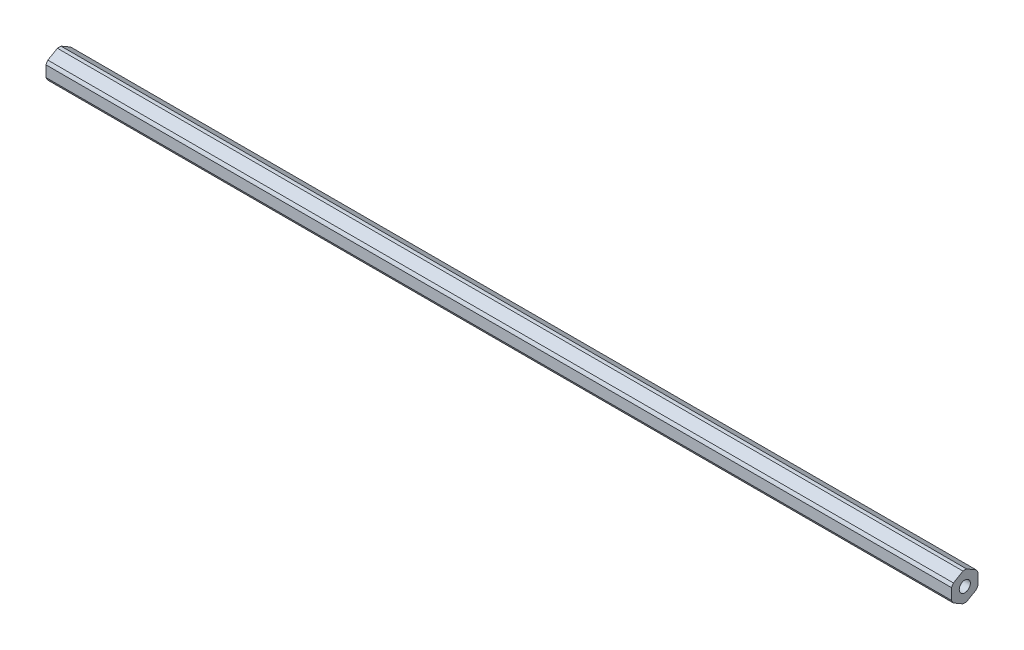
ISO-10303-21;
HEADER;
FILE_DESCRIPTION(('STEP AP214'),'2;1');
FILE_NAME('part.step','',(''),(''),'','','');
FILE_SCHEMA(('AUTOMOTIVE_DESIGN { 1 0 10303 214 1 1 1 1 }'));
ENDSEC;
DATA;
#1=APPLICATION_CONTEXT('core data for automotive mechanical design processes');
#2=APPLICATION_PROTOCOL_DEFINITION('international standard','automotive_design',2000,#1);
#3=PRODUCT_CONTEXT('',#1,'mechanical');
#4=PRODUCT('Part','Part','',(#3));
#5=PRODUCT_RELATED_PRODUCT_CATEGORY('part','',(#4));
#6=PRODUCT_DEFINITION_FORMATION('','',#4);
#7=PRODUCT_DEFINITION_CONTEXT('part definition',#1,'design');
#8=PRODUCT_DEFINITION('design','',#6,#7);
#9=PRODUCT_DEFINITION_SHAPE('','',#8);
#10=(LENGTH_UNIT() NAMED_UNIT(*) SI_UNIT(.MILLI.,.METRE.));
#11=(NAMED_UNIT(*) PLANE_ANGLE_UNIT() SI_UNIT($,.RADIAN.));
#12=(NAMED_UNIT(*) SI_UNIT($,.STERADIAN.) SOLID_ANGLE_UNIT());
#13=UNCERTAINTY_MEASURE_WITH_UNIT(LENGTH_MEASURE(1.E-05),#10,'distance_accuracy_value','');
#14=(GEOMETRIC_REPRESENTATION_CONTEXT(3) GLOBAL_UNCERTAINTY_ASSIGNED_CONTEXT((#13)) GLOBAL_UNIT_ASSIGNED_CONTEXT((#10,
#11,#12)) REPRESENTATION_CONTEXT('',''));
#15=CARTESIAN_POINT('',(0.,0.,0.));
#16=DIRECTION('',(0.,0.,1.));
#17=DIRECTION('',(1.,0.,0.));
#18=AXIS2_PLACEMENT_3D('',#15,#16,#17);
#19=CARTESIAN_POINT('',(-190.627,0.,-5.64652491430451E-13));
#20=DIRECTION('',(1.,0.,0.));
#21=DIRECTION('',(0.,0.,-1.));
#22=AXIS2_PLACEMENT_3D('',#19,#20,#21);
#23=CYLINDRICAL_SURFACE('',#22,6.88000000000029);
#24=CARTESIAN_POINT('',(244.475,0.,-5.64652491430451E-13));
#25=DIRECTION('',(1.,0.,0.));
#26=DIRECTION('',(0.,0.,-1.));
#27=AXIS2_PLACEMENT_3D('',#24,#25,#26);
#28=CIRCLE('',#27,6.88000000000029);
#29=CARTESIAN_POINT('',(244.475,2.64799924471248,-6.35000000000105));
#30=VERTEX_POINT('',#29);
#31=CARTESIAN_POINT('',(244.475,4.17526169167448,-5.46823461512449));
#32=VERTEX_POINT('',#31);
#33=EDGE_CURVE('E154',#30,#32,#28,.T.);
#34=ORIENTED_EDGE('',*,*,#33,.F.);
#35=DIRECTION('',(1.,0.,0.));
#36=VECTOR('',#35,1.);
#37=CARTESIAN_POINT('',(-190.627,2.64799924471248,-6.35000000000105));
#38=LINE('',#37,#36);
#39=CARTESIAN_POINT('',(-190.627,2.64799924471248,-6.35000000000105));
#40=VERTEX_POINT('',#39);
#41=EDGE_CURVE('E11',#40,#30,#38,.T.);
#42=ORIENTED_EDGE('',*,*,#41,.F.);
#43=CARTESIAN_POINT('',(-190.627,0.,-5.64652491430451E-13));
#44=DIRECTION('',(1.,0.,0.));
#45=DIRECTION('',(0.,0.,-1.));
#46=AXIS2_PLACEMENT_3D('',#43,#44,#45);
#47=CIRCLE('',#46,6.88000000000029);
#48=CARTESIAN_POINT('',(-190.627,4.17526169167448,-5.46823461512449));
#49=VERTEX_POINT('',#48);
#50=EDGE_CURVE('E187',#40,#49,#47,.T.);
#51=ORIENTED_EDGE('',*,*,#50,.T.);
#52=DIRECTION('',(1.,0.,0.));
#53=VECTOR('',#52,1.);
#54=CARTESIAN_POINT('',(-190.627,4.17526169167448,-5.46823461512449));
#55=LINE('',#54,#53);
#56=EDGE_CURVE('E36',#49,#32,#55,.T.);
#57=ORIENTED_EDGE('',*,*,#56,.T.);
#58=EDGE_LOOP('',(#34,#42,#51,#57));
#59=FACE_BOUND('',#58,.T.);
#60=ADVANCED_FACE('F33',(#59),#23,.T.);
#61=CARTESIAN_POINT('',(-190.627,-2.64799924471248,-6.35000000000105));
#62=DIRECTION('',(0.,0.,-1.));
#63=DIRECTION('',(-1.,0.,0.));
#64=AXIS2_PLACEMENT_3D('',#61,#62,#63);
#65=PLANE('',#64);
#66=DIRECTION('',(0.,1.,0.));
#67=VECTOR('',#66,1.);
#68=CARTESIAN_POINT('',(244.475,-2.64799924471248,-6.35000000000105));
#69=LINE('',#68,#67);
#70=CARTESIAN_POINT('',(244.475,-2.64799924471248,-6.35000000000105));
#71=VERTEX_POINT('',#70);
#72=EDGE_CURVE('E185',#71,#30,#69,.T.);
#73=ORIENTED_EDGE('',*,*,#72,.F.);
#74=DIRECTION('',(1.,0.,0.));
#75=VECTOR('',#74,1.);
#76=CARTESIAN_POINT('',(-190.627,-2.64799924471248,-6.35000000000105));
#77=LINE('',#76,#75);
#78=CARTESIAN_POINT('',(-190.627,-2.64799924471248,-6.35000000000105));
#79=VERTEX_POINT('',#78);
#80=EDGE_CURVE('E42',#79,#71,#77,.T.);
#81=ORIENTED_EDGE('',*,*,#80,.F.);
#82=DIRECTION('',(0.,1.,0.));
#83=VECTOR('',#82,1.);
#84=CARTESIAN_POINT('',(-190.627,-2.64799924471248,-6.35000000000105));
#85=LINE('',#84,#83);
#86=EDGE_CURVE('E144',#79,#40,#85,.T.);
#87=ORIENTED_EDGE('',*,*,#86,.T.);
#88=ORIENTED_EDGE('',*,*,#41,.T.);
#89=EDGE_LOOP('',(#73,#81,#87,#88));
#90=FACE_BOUND('',#89,.T.);
#91=ADVANCED_FACE('F207',(#90),#65,.T.);
#92=CARTESIAN_POINT('',(-190.627,0.,-5.64652491430451E-13));
#93=DIRECTION('',(1.,0.,0.));
#94=DIRECTION('',(0.,0.,-1.));
#95=AXIS2_PLACEMENT_3D('',#92,#93,#94);
#96=CYLINDRICAL_SURFACE('',#95,6.88000000000029);
#97=CARTESIAN_POINT('',(244.475,0.,-5.64652491430451E-13));
#98=DIRECTION('',(1.,0.,0.));
#99=DIRECTION('',(0.,0.,-1.));
#100=AXIS2_PLACEMENT_3D('',#97,#98,#99);
#101=CIRCLE('',#100,6.88000000000029);
#102=CARTESIAN_POINT('',(244.475,-4.17526169167448,-5.46823461512449));
#103=VERTEX_POINT('',#102);
#104=EDGE_CURVE('E131',#103,#71,#101,.T.);
#105=ORIENTED_EDGE('',*,*,#104,.F.);
#106=DIRECTION('',(1.,0.,0.));
#107=VECTOR('',#106,1.);
#108=CARTESIAN_POINT('',(-190.627,-4.17526169167448,-5.46823461512449));
#109=LINE('',#108,#107);
#110=CARTESIAN_POINT('',(-190.627,-4.17526169167448,-5.46823461512449));
#111=VERTEX_POINT('',#110);
#112=EDGE_CURVE('E126',#111,#103,#109,.T.);
#113=ORIENTED_EDGE('',*,*,#112,.F.);
#114=CARTESIAN_POINT('',(-190.627,0.,-5.64652491430451E-13));
#115=DIRECTION('',(1.,0.,0.));
#116=DIRECTION('',(0.,0.,-1.));
#117=AXIS2_PLACEMENT_3D('',#114,#115,#116);
#118=CIRCLE('',#117,6.88000000000029);
#119=EDGE_CURVE('E129',#111,#79,#118,.T.);
#120=ORIENTED_EDGE('',*,*,#119,.T.);
#121=ORIENTED_EDGE('',*,*,#80,.T.);
#122=EDGE_LOOP('',(#105,#113,#120,#121));
#123=FACE_BOUND('',#122,.T.);
#124=ADVANCED_FACE('F128',(#123),#96,.T.);
#125=CARTESIAN_POINT('',(-190.627,-6.8232609363879,-0.881765384877347));
#126=DIRECTION('',(0.,-0.866025403784415,-0.500000000000042));
#127=DIRECTION('',(0.,0.500000000000041,-0.866025403784415));
#128=AXIS2_PLACEMENT_3D('',#125,#126,#127);
#129=PLANE('',#128);
#130=DIRECTION('',(0.,0.500000000000042,-0.866025403784415));
#131=VECTOR('',#130,1.);
#132=CARTESIAN_POINT('',(244.475,-6.8232609363879,-0.881765384877347));
#133=LINE('',#132,#131);
#134=CARTESIAN_POINT('',(244.475,-6.8232609363879,-0.881765384877347));
#135=VERTEX_POINT('',#134);
#136=EDGE_CURVE('E182',#135,#103,#133,.T.);
#137=ORIENTED_EDGE('',*,*,#136,.F.);
#138=DIRECTION('',(1.,0.,0.));
#139=VECTOR('',#138,1.);
#140=CARTESIAN_POINT('',(-190.627,-6.8232609363879,-0.881765384877347));
#141=LINE('',#140,#139);
#142=CARTESIAN_POINT('',(-190.627,-6.8232609363879,-0.881765384877347));
#143=VERTEX_POINT('',#142);
#144=EDGE_CURVE('E136',#143,#135,#141,.T.);
#145=ORIENTED_EDGE('',*,*,#144,.F.);
#146=DIRECTION('',(0.,0.500000000000042,-0.866025403784415));
#147=VECTOR('',#146,1.);
#148=CARTESIAN_POINT('',(-190.627,-6.8232609363879,-0.881765384877347));
#149=LINE('',#148,#147);
#150=EDGE_CURVE('E142',#143,#111,#149,.T.);
#151=ORIENTED_EDGE('',*,*,#150,.T.);
#152=ORIENTED_EDGE('',*,*,#112,.T.);
#153=EDGE_LOOP('',(#137,#145,#151,#152));
#154=FACE_BOUND('',#153,.T.);
#155=ADVANCED_FACE('F146',(#154),#129,.T.);
#156=CARTESIAN_POINT('',(-190.627,0.,-5.64652491430451E-13));
#157=DIRECTION('',(1.,0.,0.));
#158=DIRECTION('',(0.,0.,-1.));
#159=AXIS2_PLACEMENT_3D('',#156,#157,#158);
#160=CYLINDRICAL_SURFACE('',#159,6.88000000000029);
#161=CARTESIAN_POINT('',(244.475,0.,-5.64652491430451E-13));
#162=DIRECTION('',(1.,0.,0.));
#163=DIRECTION('',(0.,0.,-1.));
#164=AXIS2_PLACEMENT_3D('',#161,#162,#163);
#165=CIRCLE('',#164,6.88000000000029);
#166=CARTESIAN_POINT('',(244.475,-6.8232609363879,0.881765384876218));
#167=VERTEX_POINT('',#166);
#168=EDGE_CURVE('E179',#167,#135,#165,.T.);
#169=ORIENTED_EDGE('',*,*,#168,.F.);
#170=DIRECTION('',(1.,0.,0.));
#171=VECTOR('',#170,1.);
#172=CARTESIAN_POINT('',(-190.627,-6.8232609363879,0.881765384876218));
#173=LINE('',#172,#171);
#174=CARTESIAN_POINT('',(-190.627,-6.8232609363879,0.881765384876218));
#175=VERTEX_POINT('',#174);
#176=EDGE_CURVE('E191',#175,#167,#173,.T.);
#177=ORIENTED_EDGE('',*,*,#176,.F.);
#178=CARTESIAN_POINT('',(-190.627,0.,-5.64652491430451E-13));
#179=DIRECTION('',(1.,0.,0.));
#180=DIRECTION('',(0.,0.,-1.));
#181=AXIS2_PLACEMENT_3D('',#178,#179,#180);
#182=CIRCLE('',#181,6.88000000000029);
#183=EDGE_CURVE('E147',#175,#143,#182,.T.);
#184=ORIENTED_EDGE('',*,*,#183,.T.);
#185=ORIENTED_EDGE('',*,*,#144,.T.);
#186=EDGE_LOOP('',(#169,#177,#184,#185));
#187=FACE_BOUND('',#186,.T.);
#188=ADVANCED_FACE('F220',(#187),#160,.T.);
#189=CARTESIAN_POINT('',(-190.627,-4.17526169167448,5.46823461512336));
#190=DIRECTION('',(0.,-0.866025403784415,0.500000000000042));
#191=DIRECTION('',(0.,-0.500000000000041,-0.866025403784415));
#192=AXIS2_PLACEMENT_3D('',#189,#190,#191);
#193=PLANE('',#192);
#194=DIRECTION('',(0.,-0.500000000000042,-0.866025403784415));
#195=VECTOR('',#194,1.);
#196=CARTESIAN_POINT('',(244.475,-4.17526169167448,5.46823461512336));
#197=LINE('',#196,#195);
#198=CARTESIAN_POINT('',(244.475,-4.17526169167448,5.46823461512336));
#199=VERTEX_POINT('',#198);
#200=EDGE_CURVE('E176',#199,#167,#197,.T.);
#201=ORIENTED_EDGE('',*,*,#200,.F.);
#202=DIRECTION('',(1.,0.,0.));
#203=VECTOR('',#202,1.);
#204=CARTESIAN_POINT('',(-190.627,-4.17526169167448,5.46823461512336));
#205=LINE('',#204,#203);
#206=CARTESIAN_POINT('',(-190.627,-4.17526169167448,5.46823461512336));
#207=VERTEX_POINT('',#206);
#208=EDGE_CURVE('E193',#207,#199,#205,.T.);
#209=ORIENTED_EDGE('',*,*,#208,.F.);
#210=DIRECTION('',(0.,-0.500000000000042,-0.866025403784415));
#211=VECTOR('',#210,1.);
#212=CARTESIAN_POINT('',(-190.627,-4.17526169167448,5.46823461512336));
#213=LINE('',#212,#211);
#214=EDGE_CURVE('E149',#207,#175,#213,.T.);
#215=ORIENTED_EDGE('',*,*,#214,.T.);
#216=ORIENTED_EDGE('',*,*,#176,.T.);
#217=EDGE_LOOP('',(#201,#209,#215,#216));
#218=FACE_BOUND('',#217,.T.);
#219=ADVANCED_FACE('F223',(#218),#193,.T.);
#220=CARTESIAN_POINT('',(-190.627,0.,-5.64652491430451E-13));
#221=DIRECTION('',(1.,0.,0.));
#222=DIRECTION('',(0.,0.,-1.));
#223=AXIS2_PLACEMENT_3D('',#220,#221,#222);
#224=CYLINDRICAL_SURFACE('',#223,6.88000000000029);
#225=CARTESIAN_POINT('',(244.475,0.,-5.64652491430451E-13));
#226=DIRECTION('',(1.,0.,0.));
#227=DIRECTION('',(0.,0.,-1.));
#228=AXIS2_PLACEMENT_3D('',#225,#226,#227);
#229=CIRCLE('',#228,6.88000000000029);
#230=CARTESIAN_POINT('',(244.475,-2.64799924471228,6.35));
#231=VERTEX_POINT('',#230);
#232=EDGE_CURVE('E173',#231,#199,#229,.T.);
#233=ORIENTED_EDGE('',*,*,#232,.F.);
#234=DIRECTION('',(1.,0.,0.));
#235=VECTOR('',#234,1.);
#236=CARTESIAN_POINT('',(-190.627,-2.64799924471228,6.35));
#237=LINE('',#236,#235);
#238=CARTESIAN_POINT('',(-190.627,-2.64799924471228,6.35));
#239=VERTEX_POINT('',#238);
#240=EDGE_CURVE('E195',#239,#231,#237,.T.);
#241=ORIENTED_EDGE('',*,*,#240,.F.);
#242=CARTESIAN_POINT('',(-190.627,0.,-5.64652491430451E-13));
#243=DIRECTION('',(1.,0.,0.));
#244=DIRECTION('',(0.,0.,-1.));
#245=AXIS2_PLACEMENT_3D('',#242,#243,#244);
#246=CIRCLE('',#245,6.88000000000029);
#247=EDGE_CURVE('E286',#239,#207,#246,.T.);
#248=ORIENTED_EDGE('',*,*,#247,.T.);
#249=ORIENTED_EDGE('',*,*,#208,.T.);
#250=EDGE_LOOP('',(#233,#241,#248,#249));
#251=FACE_BOUND('',#250,.T.);
#252=ADVANCED_FACE('F227',(#251),#224,.T.);
#253=CARTESIAN_POINT('',(-190.627,2.64799924471228,6.35));
#254=DIRECTION('',(0.,0.,1.));
#255=DIRECTION('',(1.,0.,0.));
#256=AXIS2_PLACEMENT_3D('',#253,#254,#255);
#257=PLANE('',#256);
#258=DIRECTION('',(0.,-1.,0.));
#259=VECTOR('',#258,1.);
#260=CARTESIAN_POINT('',(244.475,2.64799924471228,6.35));
#261=LINE('',#260,#259);
#262=CARTESIAN_POINT('',(244.475,2.64799924471228,6.35));
#263=VERTEX_POINT('',#262);
#264=EDGE_CURVE('E170',#263,#231,#261,.T.);
#265=ORIENTED_EDGE('',*,*,#264,.F.);
#266=DIRECTION('',(1.,0.,0.));
#267=VECTOR('',#266,1.);
#268=CARTESIAN_POINT('',(-190.627,2.64799924471228,6.35));
#269=LINE('',#268,#267);
#270=CARTESIAN_POINT('',(-190.627,2.64799924471228,6.35));
#271=VERTEX_POINT('',#270);
#272=EDGE_CURVE('E197',#271,#263,#269,.T.);
#273=ORIENTED_EDGE('',*,*,#272,.F.);
#274=DIRECTION('',(0.,-1.,0.));
#275=VECTOR('',#274,1.);
#276=CARTESIAN_POINT('',(-190.627,2.64799924471228,6.35));
#277=LINE('',#276,#275);
#278=EDGE_CURVE('E283',#271,#239,#277,.T.);
#279=ORIENTED_EDGE('',*,*,#278,.T.);
#280=ORIENTED_EDGE('',*,*,#240,.T.);
#281=EDGE_LOOP('',(#265,#273,#279,#280));
#282=FACE_BOUND('',#281,.T.);
#283=ADVANCED_FACE('F231',(#282),#257,.T.);
#284=CARTESIAN_POINT('',(-190.627,0.,-5.64652491430451E-13));
#285=DIRECTION('',(1.,0.,0.));
#286=DIRECTION('',(0.,0.,-1.));
#287=AXIS2_PLACEMENT_3D('',#284,#285,#286);
#288=CYLINDRICAL_SURFACE('',#287,6.88000000000029);
#289=CARTESIAN_POINT('',(244.475,0.,-5.64652491430451E-13));
#290=DIRECTION('',(1.,0.,0.));
#291=DIRECTION('',(0.,0.,-1.));
#292=AXIS2_PLACEMENT_3D('',#289,#290,#291);
#293=CIRCLE('',#292,6.88000000000029);
#294=CARTESIAN_POINT('',(244.475,4.17526169167448,5.46823461512336));
#295=VERTEX_POINT('',#294);
#296=EDGE_CURVE('E167',#295,#263,#293,.T.);
#297=ORIENTED_EDGE('',*,*,#296,.F.);
#298=DIRECTION('',(1.,0.,0.));
#299=VECTOR('',#298,1.);
#300=CARTESIAN_POINT('',(-190.627,4.17526169167448,5.46823461512336));
#301=LINE('',#300,#299);
#302=CARTESIAN_POINT('',(-190.627,4.17526169167448,5.46823461512336));
#303=VERTEX_POINT('',#302);
#304=EDGE_CURVE('E199',#303,#295,#301,.T.);
#305=ORIENTED_EDGE('',*,*,#304,.F.);
#306=CARTESIAN_POINT('',(-190.627,0.,-5.64652491430451E-13));
#307=DIRECTION('',(1.,0.,0.));
#308=DIRECTION('',(0.,0.,-1.));
#309=AXIS2_PLACEMENT_3D('',#306,#307,#308);
#310=CIRCLE('',#309,6.88000000000029);
#311=EDGE_CURVE('E280',#303,#271,#310,.T.);
#312=ORIENTED_EDGE('',*,*,#311,.T.);
#313=ORIENTED_EDGE('',*,*,#272,.T.);
#314=EDGE_LOOP('',(#297,#305,#312,#313));
#315=FACE_BOUND('',#314,.T.);
#316=ADVANCED_FACE('F235',(#315),#288,.T.);
#317=CARTESIAN_POINT('',(-190.627,6.8232609363879,0.881765384876217));
#318=DIRECTION('',(0.,0.866025403784415,0.500000000000042));
#319=DIRECTION('',(0.,-0.500000000000041,0.866025403784415));
#320=AXIS2_PLACEMENT_3D('',#317,#318,#319);
#321=PLANE('',#320);
#322=DIRECTION('',(0.,-0.500000000000042,0.866025403784415));
#323=VECTOR('',#322,1.);
#324=CARTESIAN_POINT('',(244.475,6.8232609363879,0.881765384876217));
#325=LINE('',#324,#323);
#326=CARTESIAN_POINT('',(244.475,6.8232609363879,0.881765384876217));
#327=VERTEX_POINT('',#326);
#328=EDGE_CURVE('E164',#327,#295,#325,.T.);
#329=ORIENTED_EDGE('',*,*,#328,.F.);
#330=DIRECTION('',(1.,0.,0.));
#331=VECTOR('',#330,1.);
#332=CARTESIAN_POINT('',(-190.627,6.8232609363879,0.881765384876217));
#333=LINE('',#332,#331);
#334=CARTESIAN_POINT('',(-190.627,6.8232609363879,0.881765384876217));
#335=VERTEX_POINT('',#334);
#336=EDGE_CURVE('E201',#335,#327,#333,.T.);
#337=ORIENTED_EDGE('',*,*,#336,.F.);
#338=DIRECTION('',(0.,-0.500000000000042,0.866025403784415));
#339=VECTOR('',#338,1.);
#340=CARTESIAN_POINT('',(-190.627,6.8232609363879,0.881765384876217));
#341=LINE('',#340,#339);
#342=EDGE_CURVE('E277',#335,#303,#341,.T.);
#343=ORIENTED_EDGE('',*,*,#342,.T.);
#344=ORIENTED_EDGE('',*,*,#304,.T.);
#345=EDGE_LOOP('',(#329,#337,#343,#344));
#346=FACE_BOUND('',#345,.T.);
#347=ADVANCED_FACE('F239',(#346),#321,.T.);
#348=CARTESIAN_POINT('',(-190.627,0.,-5.64652491430451E-13));
#349=DIRECTION('',(1.,0.,0.));
#350=DIRECTION('',(0.,0.,-1.));
#351=AXIS2_PLACEMENT_3D('',#348,#349,#350);
#352=CYLINDRICAL_SURFACE('',#351,6.88000000000029);
#353=CARTESIAN_POINT('',(244.475,0.,-5.64652491430451E-13));
#354=DIRECTION('',(1.,0.,0.));
#355=DIRECTION('',(0.,0.,-1.));
#356=AXIS2_PLACEMENT_3D('',#353,#354,#355);
#357=CIRCLE('',#356,6.88000000000029);
#358=CARTESIAN_POINT('',(244.475,6.8232609363879,-0.881765384877347));
#359=VERTEX_POINT('',#358);
#360=EDGE_CURVE('E161',#359,#327,#357,.T.);
#361=ORIENTED_EDGE('',*,*,#360,.F.);
#362=DIRECTION('',(1.,0.,0.));
#363=VECTOR('',#362,1.);
#364=CARTESIAN_POINT('',(-190.627,6.8232609363879,-0.881765384877347));
#365=LINE('',#364,#363);
#366=CARTESIAN_POINT('',(-190.627,6.8232609363879,-0.881765384877347));
#367=VERTEX_POINT('',#366);
#368=EDGE_CURVE('E202',#367,#359,#365,.T.);
#369=ORIENTED_EDGE('',*,*,#368,.F.);
#370=CARTESIAN_POINT('',(-190.627,0.,-5.64652491430451E-13));
#371=DIRECTION('',(1.,0.,0.));
#372=DIRECTION('',(0.,0.,-1.));
#373=AXIS2_PLACEMENT_3D('',#370,#371,#372);
#374=CIRCLE('',#373,6.88000000000029);
#375=EDGE_CURVE('E274',#367,#335,#374,.T.);
#376=ORIENTED_EDGE('',*,*,#375,.T.);
#377=ORIENTED_EDGE('',*,*,#336,.T.);
#378=EDGE_LOOP('',(#361,#369,#376,#377));
#379=FACE_BOUND('',#378,.T.);
#380=ADVANCED_FACE('F243',(#379),#352,.T.);
#381=CARTESIAN_POINT('',(-190.627,4.17526169167448,-5.46823461512449));
#382=DIRECTION('',(0.,0.866025403784415,-0.500000000000042));
#383=DIRECTION('',(0.,0.500000000000041,0.866025403784415));
#384=AXIS2_PLACEMENT_3D('',#381,#382,#383);
#385=PLANE('',#384);
#386=DIRECTION('',(0.,0.500000000000042,0.866025403784415));
#387=VECTOR('',#386,1.);
#388=CARTESIAN_POINT('',(244.475,4.17526169167448,-5.46823461512449));
#389=LINE('',#388,#387);
#390=EDGE_CURVE('E157',#32,#359,#389,.T.);
#391=ORIENTED_EDGE('',*,*,#390,.F.);
#392=ORIENTED_EDGE('',*,*,#56,.F.);
#393=DIRECTION('',(0.,0.500000000000042,0.866025403784415));
#394=VECTOR('',#393,1.);
#395=CARTESIAN_POINT('',(-190.627,4.17526169167448,-5.46823461512449));
#396=LINE('',#395,#394);
#397=EDGE_CURVE('E272',#49,#367,#396,.T.);
#398=ORIENTED_EDGE('',*,*,#397,.T.);
#399=ORIENTED_EDGE('',*,*,#368,.T.);
#400=EDGE_LOOP('',(#391,#392,#398,#399));
#401=FACE_BOUND('',#400,.T.);
#402=ADVANCED_FACE('F204',(#401),#385,.T.);
#403=CARTESIAN_POINT('',(-190.627,0.,-5.64652491430451E-13));
#404=DIRECTION('',(1.,0.,0.));
#405=DIRECTION('',(0.,0.,-1.));
#406=AXIS2_PLACEMENT_3D('',#403,#404,#405);
#407=PLANE('',#406);
#408=CARTESIAN_POINT('',(-190.627,0.,-5.64652491430451E-13));
#409=DIRECTION('',(1.,0.,0.));
#410=DIRECTION('',(0.,0.,1.));
#411=AXIS2_PLACEMENT_3D('',#408,#409,#410);
#412=CIRCLE('',#411,2.66700000000056);
#413=CARTESIAN_POINT('',(-190.627,0.,2.667));
#414=VERTEX_POINT('',#413);
#415=EDGE_CURVE('E158',#414,#414,#412,.T.);
#416=ORIENTED_EDGE('',*,*,#415,.T.);
#417=EDGE_LOOP('',(#416));
#418=FACE_BOUND('',#417,.T.);
#419=ORIENTED_EDGE('',*,*,#50,.F.);
#420=ORIENTED_EDGE('',*,*,#86,.F.);
#421=ORIENTED_EDGE('',*,*,#119,.F.);
#422=ORIENTED_EDGE('',*,*,#150,.F.);
#423=ORIENTED_EDGE('',*,*,#183,.F.);
#424=ORIENTED_EDGE('',*,*,#214,.F.);
#425=ORIENTED_EDGE('',*,*,#247,.F.);
#426=ORIENTED_EDGE('',*,*,#278,.F.);
#427=ORIENTED_EDGE('',*,*,#311,.F.);
#428=ORIENTED_EDGE('',*,*,#342,.F.);
#429=ORIENTED_EDGE('',*,*,#375,.F.);
#430=ORIENTED_EDGE('',*,*,#397,.F.);
#431=EDGE_LOOP('',(#419,#420,#421,#422,#423,#424,#425,#426,#427,#428,#429,#430));
#432=FACE_BOUND('',#431,.T.);
#433=ADVANCED_FACE('F140',(#418,#432),#407,.F.);
#434=CARTESIAN_POINT('',(244.475,0.,-5.64652491430451E-13));
#435=DIRECTION('',(1.,0.,0.));
#436=DIRECTION('',(0.,0.,-1.));
#437=AXIS2_PLACEMENT_3D('',#434,#435,#436);
#438=PLANE('',#437);
#439=CARTESIAN_POINT('',(244.475,0.,-5.64652491430451E-13));
#440=DIRECTION('',(1.,0.,0.));
#441=DIRECTION('',(0.,0.,1.));
#442=AXIS2_PLACEMENT_3D('',#439,#440,#441);
#443=CIRCLE('',#442,2.66700000000056);
#444=CARTESIAN_POINT('',(244.475,0.,2.667));
#445=VERTEX_POINT('',#444);
#446=EDGE_CURVE('E267',#445,#445,#443,.T.);
#447=ORIENTED_EDGE('',*,*,#446,.F.);
#448=EDGE_LOOP('',(#447));
#449=FACE_BOUND('',#448,.T.);
#450=ORIENTED_EDGE('',*,*,#33,.T.);
#451=ORIENTED_EDGE('',*,*,#390,.T.);
#452=ORIENTED_EDGE('',*,*,#360,.T.);
#453=ORIENTED_EDGE('',*,*,#328,.T.);
#454=ORIENTED_EDGE('',*,*,#296,.T.);
#455=ORIENTED_EDGE('',*,*,#264,.T.);
#456=ORIENTED_EDGE('',*,*,#232,.T.);
#457=ORIENTED_EDGE('',*,*,#200,.T.);
#458=ORIENTED_EDGE('',*,*,#168,.T.);
#459=ORIENTED_EDGE('',*,*,#136,.T.);
#460=ORIENTED_EDGE('',*,*,#104,.T.);
#461=ORIENTED_EDGE('',*,*,#72,.T.);
#462=EDGE_LOOP('',(#450,#451,#452,#453,#454,#455,#456,#457,#458,#459,#460,#461));
#463=FACE_BOUND('',#462,.T.);
#464=ADVANCED_FACE('F206',(#449,#463),#438,.T.);
#465=CARTESIAN_POINT('',(-190.627,0.,-5.64652491430451E-13));
#466=DIRECTION('',(1.,0.,0.));
#467=DIRECTION('',(0.,0.,-1.));
#468=AXIS2_PLACEMENT_3D('',#465,#466,#467);
#469=CYLINDRICAL_SURFACE('',#468,2.66700000000056);
#470=ORIENTED_EDGE('',*,*,#415,.F.);
#471=EDGE_LOOP('',(#470));
#472=FACE_BOUND('',#471,.T.);
#473=ORIENTED_EDGE('',*,*,#446,.T.);
#474=EDGE_LOOP('',(#473));
#475=FACE_BOUND('',#474,.T.);
#476=ADVANCED_FACE('F255',(#472,#475),#469,.F.);
#477=CLOSED_SHELL('',(#60,#91,#124,#155,#188,#219,#252,#283,#316,#347,#380,#402,#433,#464,#476));
#478=MANIFOLD_SOLID_BREP('B2',#477);
#479=ADVANCED_BREP_SHAPE_REPRESENTATION('',(#18,#478),#14);
#480=SHAPE_DEFINITION_REPRESENTATION(#9,#479);
ENDSEC;
END-ISO-10303-21;
